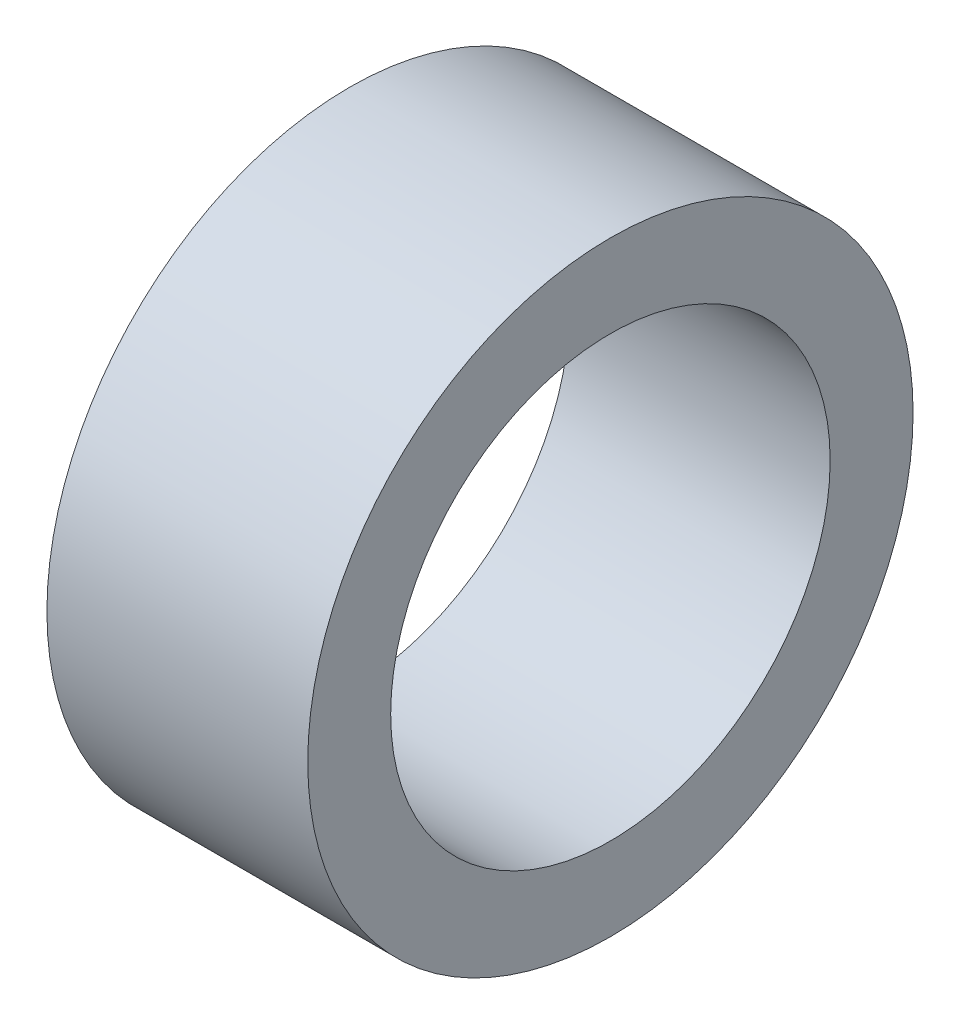
ISO-10303-21;
HEADER;
FILE_DESCRIPTION(('STEP AP214'),'2;1');
FILE_NAME('part.step','',(''),(''),'','','');
FILE_SCHEMA(('AUTOMOTIVE_DESIGN { 1 0 10303 214 1 1 1 1 }'));
ENDSEC;
DATA;
#1=APPLICATION_CONTEXT('core data for automotive mechanical design processes');
#2=APPLICATION_PROTOCOL_DEFINITION('international standard','automotive_design',2000,#1);
#3=PRODUCT_CONTEXT('',#1,'mechanical');
#4=PRODUCT('Part','Part','',(#3));
#5=PRODUCT_RELATED_PRODUCT_CATEGORY('part','',(#4));
#6=PRODUCT_DEFINITION_FORMATION('','',#4);
#7=PRODUCT_DEFINITION_CONTEXT('part definition',#1,'design');
#8=PRODUCT_DEFINITION('design','',#6,#7);
#9=PRODUCT_DEFINITION_SHAPE('','',#8);
#10=(LENGTH_UNIT() NAMED_UNIT(*) SI_UNIT(.MILLI.,.METRE.));
#11=(NAMED_UNIT(*) PLANE_ANGLE_UNIT() SI_UNIT($,.RADIAN.));
#12=(NAMED_UNIT(*) SI_UNIT($,.STERADIAN.) SOLID_ANGLE_UNIT());
#13=UNCERTAINTY_MEASURE_WITH_UNIT(LENGTH_MEASURE(1.E-05),#10,'distance_accuracy_value','');
#14=(GEOMETRIC_REPRESENTATION_CONTEXT(3) GLOBAL_UNCERTAINTY_ASSIGNED_CONTEXT((#13)) GLOBAL_UNIT_ASSIGNED_CONTEXT((#10,
#11,#12)) REPRESENTATION_CONTEXT('',''));
#15=CARTESIAN_POINT('',(0.,0.,0.));
#16=DIRECTION('',(0.,0.,1.));
#17=DIRECTION('',(1.,0.,0.));
#18=AXIS2_PLACEMENT_3D('',#15,#16,#17);
#19=CARTESIAN_POINT('',(-31.7498717477064,0.,0.));
#20=DIRECTION('',(-1.,0.,0.));
#21=DIRECTION('',(0.,0.,1.));
#22=AXIS2_PLACEMENT_3D('',#19,#20,#21);
#23=CYLINDRICAL_SURFACE('',#22,19.05);
#24=CARTESIAN_POINT('',(-31.7498717477064,0.,0.));
#25=DIRECTION('',(-1.,0.,0.));
#26=DIRECTION('',(0.,0.,1.));
#27=AXIS2_PLACEMENT_3D('',#24,#25,#26);
#28=CIRCLE('',#27,19.05);
#29=CARTESIAN_POINT('',(-31.7498717477064,0.,19.05));
#30=VERTEX_POINT('',#29);
#31=EDGE_CURVE('E26',#30,#30,#28,.F.);
#32=ORIENTED_EDGE('',*,*,#31,.T.);
#33=EDGE_LOOP('',(#32));
#34=FACE_BOUND('',#33,.T.);
#35=CARTESIAN_POINT('',(-54.3631804076554,0.,0.));
#36=DIRECTION('',(-1.,0.,0.));
#37=DIRECTION('',(0.,0.,1.));
#38=AXIS2_PLACEMENT_3D('',#35,#36,#37);
#39=CIRCLE('',#38,19.05);
#40=CARTESIAN_POINT('',(-54.3631804076553,0.,19.05));
#41=VERTEX_POINT('',#40);
#42=EDGE_CURVE('E17',#41,#41,#39,.F.);
#43=ORIENTED_EDGE('',*,*,#42,.F.);
#44=EDGE_LOOP('',(#43));
#45=FACE_BOUND('',#44,.T.);
#46=ADVANCED_FACE('F14',(#34,#45),#23,.F.);
#47=CARTESIAN_POINT('',(-54.3631804076554,0.,0.));
#48=DIRECTION('',(-1.,0.,0.));
#49=DIRECTION('',(0.,0.,1.));
#50=AXIS2_PLACEMENT_3D('',#47,#48,#49);
#51=PLANE('',#50);
#52=CARTESIAN_POINT('',(-54.3631804076554,0.,0.));
#53=DIRECTION('',(-1.,0.,0.));
#54=DIRECTION('',(0.,0.,1.));
#55=AXIS2_PLACEMENT_3D('',#52,#53,#54);
#56=CIRCLE('',#55,26.2391579348585);
#57=CARTESIAN_POINT('',(-54.3631804076553,0.,26.2391579348585));
#58=VERTEX_POINT('',#57);
#59=EDGE_CURVE('E21',#58,#58,#56,.F.);
#60=ORIENTED_EDGE('',*,*,#59,.F.);
#61=EDGE_LOOP('',(#60));
#62=FACE_BOUND('',#61,.T.);
#63=ORIENTED_EDGE('',*,*,#42,.T.);
#64=EDGE_LOOP('',(#63));
#65=FACE_BOUND('',#64,.T.);
#66=ADVANCED_FACE('F34',(#62,#65),#51,.T.);
#67=CARTESIAN_POINT('',(-31.7498717477064,0.,0.));
#68=DIRECTION('',(-1.,0.,0.));
#69=DIRECTION('',(0.,0.,1.));
#70=AXIS2_PLACEMENT_3D('',#67,#68,#69);
#71=PLANE('',#70);
#72=CARTESIAN_POINT('',(-31.7498717477064,0.,0.));
#73=DIRECTION('',(-1.,0.,0.));
#74=DIRECTION('',(0.,0.,1.));
#75=AXIS2_PLACEMENT_3D('',#72,#73,#74);
#76=CIRCLE('',#75,26.2391579348585);
#77=CARTESIAN_POINT('',(-31.7498717477064,0.,26.2391579348585));
#78=VERTEX_POINT('',#77);
#79=EDGE_CURVE('E9',#78,#78,#76,.T.);
#80=ORIENTED_EDGE('',*,*,#79,.F.);
#81=EDGE_LOOP('',(#80));
#82=FACE_BOUND('',#81,.T.);
#83=ORIENTED_EDGE('',*,*,#31,.F.);
#84=EDGE_LOOP('',(#83));
#85=FACE_BOUND('',#84,.T.);
#86=ADVANCED_FACE('F41',(#82,#85),#71,.F.);
#87=CARTESIAN_POINT('',(-31.7498717477064,0.,0.));
#88=DIRECTION('',(-1.,0.,0.));
#89=DIRECTION('',(0.,0.,1.));
#90=AXIS2_PLACEMENT_3D('',#87,#88,#89);
#91=CYLINDRICAL_SURFACE('',#90,26.2391579348585);
#92=ORIENTED_EDGE('',*,*,#59,.T.);
#93=EDGE_LOOP('',(#92));
#94=FACE_BOUND('',#93,.T.);
#95=ORIENTED_EDGE('',*,*,#79,.T.);
#96=EDGE_LOOP('',(#95));
#97=FACE_BOUND('',#96,.T.);
#98=ADVANCED_FACE('F43',(#94,#97),#91,.T.);
#99=CLOSED_SHELL('',(#46,#66,#86,#98));
#100=MANIFOLD_SOLID_BREP('B1',#99);
#101=ADVANCED_BREP_SHAPE_REPRESENTATION('',(#18,#100),#14);
#102=SHAPE_DEFINITION_REPRESENTATION(#9,#101);
ENDSEC;
END-ISO-10303-21;
